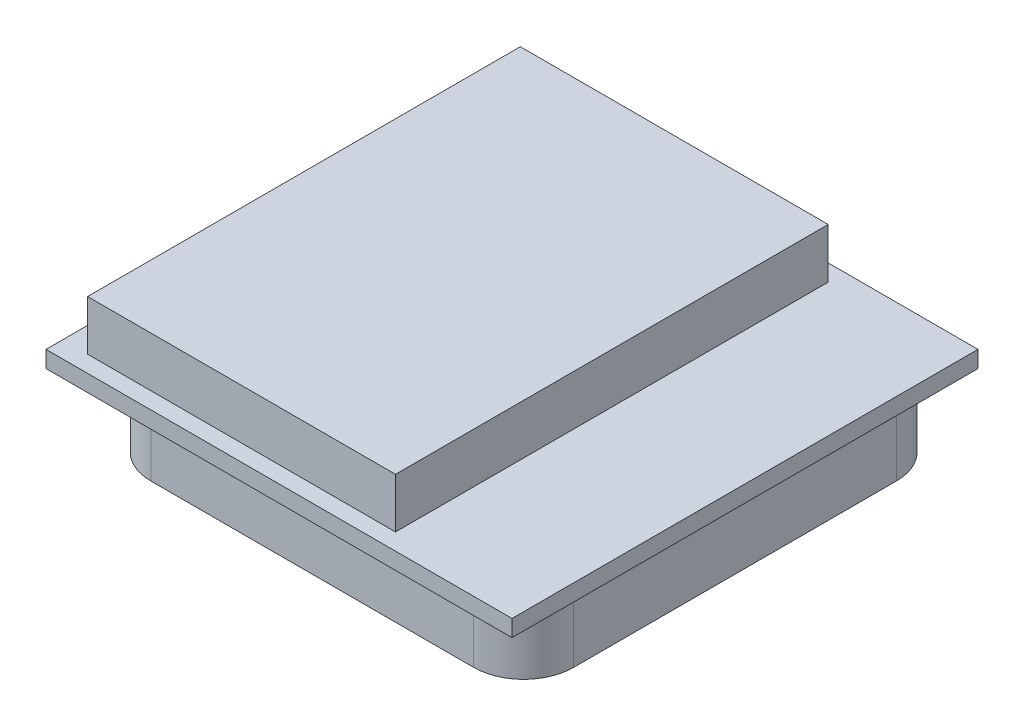
ISO-10303-21;
HEADER;
FILE_DESCRIPTION(('STEP AP214'),'2;1');
FILE_NAME('part.step','',(''),(''),'','','');
FILE_SCHEMA(('AUTOMOTIVE_DESIGN { 1 0 10303 214 1 1 1 1 }'));
ENDSEC;
DATA;
#1=APPLICATION_CONTEXT('core data for automotive mechanical design processes');
#2=APPLICATION_PROTOCOL_DEFINITION('international standard','automotive_design',2000,#1);
#3=PRODUCT_CONTEXT('',#1,'mechanical');
#4=PRODUCT('Part','Part','',(#3));
#5=PRODUCT_RELATED_PRODUCT_CATEGORY('part','',(#4));
#6=PRODUCT_DEFINITION_FORMATION('','',#4);
#7=PRODUCT_DEFINITION_CONTEXT('part definition',#1,'design');
#8=PRODUCT_DEFINITION('design','',#6,#7);
#9=PRODUCT_DEFINITION_SHAPE('','',#8);
#10=(LENGTH_UNIT() NAMED_UNIT(*) SI_UNIT(.MILLI.,.METRE.));
#11=(NAMED_UNIT(*) PLANE_ANGLE_UNIT() SI_UNIT($,.RADIAN.));
#12=(NAMED_UNIT(*) SI_UNIT($,.STERADIAN.) SOLID_ANGLE_UNIT());
#13=UNCERTAINTY_MEASURE_WITH_UNIT(LENGTH_MEASURE(1.E-05),#10,'distance_accuracy_value','');
#14=(GEOMETRIC_REPRESENTATION_CONTEXT(3) GLOBAL_UNCERTAINTY_ASSIGNED_CONTEXT((#13)) GLOBAL_UNIT_ASSIGNED_CONTEXT((#10,
#11,#12)) REPRESENTATION_CONTEXT('',''));
#15=CARTESIAN_POINT('',(0.,0.,0.));
#16=DIRECTION('',(0.,0.,1.));
#17=DIRECTION('',(1.,0.,0.));
#18=AXIS2_PLACEMENT_3D('',#15,#16,#17);
#19=CARTESIAN_POINT('',(0.,0.,0.));
#20=DIRECTION('',(0.,1.,0.));
#21=DIRECTION('',(0.,0.,1.));
#22=AXIS2_PLACEMENT_3D('',#19,#20,#21);
#23=PLANE('',#22);
#24=DIRECTION('',(0.,0.,1.));
#25=VECTOR('',#24,1.);
#26=CARTESIAN_POINT('',(-12.,0.,-12.7));
#27=LINE('',#26,#25);
#28=CARTESIAN_POINT('',(-12.,0.,-9.7));
#29=VERTEX_POINT('',#28);
#30=CARTESIAN_POINT('',(-12.,0.,9.7));
#31=VERTEX_POINT('',#30);
#32=EDGE_CURVE('E186',#29,#31,#27,.T.);
#33=ORIENTED_EDGE('',*,*,#32,.T.);
#34=CARTESIAN_POINT('',(-9.,0.,9.7));
#35=DIRECTION('',(0.,1.,0.));
#36=DIRECTION('',(0.,0.,1.));
#37=AXIS2_PLACEMENT_3D('',#34,#35,#36);
#38=CIRCLE('',#37,3.);
#39=CARTESIAN_POINT('',(-9.,0.,12.7));
#40=VERTEX_POINT('',#39);
#41=EDGE_CURVE('E270',#31,#40,#38,.T.);
#42=ORIENTED_EDGE('',*,*,#41,.T.);
#43=DIRECTION('',(1.,0.,0.));
#44=VECTOR('',#43,1.);
#45=CARTESIAN_POINT('',(-12.,0.,12.7));
#46=LINE('',#45,#44);
#47=CARTESIAN_POINT('',(10.4,0.,12.7));
#48=VERTEX_POINT('',#47);
#49=EDGE_CURVE('E200',#40,#48,#46,.T.);
#50=ORIENTED_EDGE('',*,*,#49,.T.);
#51=CARTESIAN_POINT('',(10.4,0.,9.7));
#52=DIRECTION('',(0.,1.,0.));
#53=DIRECTION('',(0.,0.,1.));
#54=AXIS2_PLACEMENT_3D('',#51,#52,#53);
#55=CIRCLE('',#54,3.);
#56=CARTESIAN_POINT('',(13.4,0.,9.7));
#57=VERTEX_POINT('',#56);
#58=EDGE_CURVE('E272',#48,#57,#55,.T.);
#59=ORIENTED_EDGE('',*,*,#58,.T.);
#60=DIRECTION('',(0.,0.,1.));
#61=VECTOR('',#60,1.);
#62=CARTESIAN_POINT('',(13.4,0.,-12.7));
#63=LINE('',#62,#61);
#64=CARTESIAN_POINT('',(13.4,0.,-9.7));
#65=VERTEX_POINT('',#64);
#66=EDGE_CURVE('E197',#65,#57,#63,.T.);
#67=ORIENTED_EDGE('',*,*,#66,.F.);
#68=CARTESIAN_POINT('',(10.4,0.,-9.7));
#69=DIRECTION('',(0.,1.,0.));
#70=DIRECTION('',(0.,0.,1.));
#71=AXIS2_PLACEMENT_3D('',#68,#69,#70);
#72=CIRCLE('',#71,3.);
#73=CARTESIAN_POINT('',(10.4,0.,-12.7));
#74=VERTEX_POINT('',#73);
#75=EDGE_CURVE('E43',#65,#74,#72,.T.);
#76=ORIENTED_EDGE('',*,*,#75,.T.);
#77=DIRECTION('',(1.,0.,0.));
#78=VECTOR('',#77,1.);
#79=CARTESIAN_POINT('',(-12.,0.,-12.7));
#80=LINE('',#79,#78);
#81=CARTESIAN_POINT('',(-9.,0.,-12.7));
#82=VERTEX_POINT('',#81);
#83=EDGE_CURVE('E177',#82,#74,#80,.T.);
#84=ORIENTED_EDGE('',*,*,#83,.F.);
#85=CARTESIAN_POINT('',(-9.,0.,-9.7));
#86=DIRECTION('',(0.,1.,0.));
#87=DIRECTION('',(0.,0.,1.));
#88=AXIS2_PLACEMENT_3D('',#85,#86,#87);
#89=CIRCLE('',#88,3.);
#90=EDGE_CURVE('E11',#82,#29,#89,.T.);
#91=ORIENTED_EDGE('',*,*,#90,.T.);
#92=EDGE_LOOP('',(#33,#42,#50,#59,#67,#76,#84,#91));
#93=FACE_BOUND('',#92,.T.);
#94=DIRECTION('',(1.,0.,0.));
#95=VECTOR('',#94,1.);
#96=CARTESIAN_POINT('',(0.,0.,14.));
#97=LINE('',#96,#95);
#98=CARTESIAN_POINT('',(-14.,0.,14.));
#99=VERTEX_POINT('',#98);
#100=CARTESIAN_POINT('',(14.,0.,14.));
#101=VERTEX_POINT('',#100);
#102=EDGE_CURVE('E195',#99,#101,#97,.T.);
#103=ORIENTED_EDGE('',*,*,#102,.F.);
#104=DIRECTION('',(0.,0.,-1.));
#105=VECTOR('',#104,1.);
#106=CARTESIAN_POINT('',(-14.,0.,0.));
#107=LINE('',#106,#105);
#108=CARTESIAN_POINT('',(-14.,0.,-14.));
#109=VERTEX_POINT('',#108);
#110=EDGE_CURVE('E209',#99,#109,#107,.T.);
#111=ORIENTED_EDGE('',*,*,#110,.T.);
#112=DIRECTION('',(1.,0.,0.));
#113=VECTOR('',#112,1.);
#114=CARTESIAN_POINT('',(0.,0.,-14.));
#115=LINE('',#114,#113);
#116=CARTESIAN_POINT('',(14.,0.,-14.));
#117=VERTEX_POINT('',#116);
#118=EDGE_CURVE('E223',#109,#117,#115,.T.);
#119=ORIENTED_EDGE('',*,*,#118,.T.);
#120=DIRECTION('',(0.,0.,-1.));
#121=VECTOR('',#120,1.);
#122=CARTESIAN_POINT('',(14.,0.,0.));
#123=LINE('',#122,#121);
#124=EDGE_CURVE('E220',#101,#117,#123,.T.);
#125=ORIENTED_EDGE('',*,*,#124,.F.);
#126=EDGE_LOOP('',(#103,#111,#119,#125));
#127=FACE_BOUND('',#126,.T.);
#128=ADVANCED_FACE('F35',(#93,#127),#23,.F.);
#129=CARTESIAN_POINT('',(0.,1.,14.));
#130=DIRECTION('',(0.,0.,-1.));
#131=DIRECTION('',(-1.,0.,0.));
#132=AXIS2_PLACEMENT_3D('',#129,#130,#131);
#133=PLANE('',#132);
#134=ORIENTED_EDGE('',*,*,#102,.T.);
#135=DIRECTION('',(0.,-1.,0.));
#136=VECTOR('',#135,1.);
#137=CARTESIAN_POINT('',(14.,1.,14.));
#138=LINE('',#137,#136);
#139=CARTESIAN_POINT('',(14.,1.,14.));
#140=VERTEX_POINT('',#139);
#141=EDGE_CURVE('E233',#140,#101,#138,.T.);
#142=ORIENTED_EDGE('',*,*,#141,.F.);
#143=DIRECTION('',(1.,0.,0.));
#144=VECTOR('',#143,1.);
#145=CARTESIAN_POINT('',(0.,1.,14.));
#146=LINE('',#145,#144);
#147=CARTESIAN_POINT('',(-14.,1.,14.));
#148=VERTEX_POINT('',#147);
#149=EDGE_CURVE('E205',#148,#140,#146,.T.);
#150=ORIENTED_EDGE('',*,*,#149,.F.);
#151=DIRECTION('',(0.,-1.,0.));
#152=VECTOR('',#151,1.);
#153=CARTESIAN_POINT('',(-14.,1.,14.));
#154=LINE('',#153,#152);
#155=EDGE_CURVE('E217',#148,#99,#154,.T.);
#156=ORIENTED_EDGE('',*,*,#155,.T.);
#157=EDGE_LOOP('',(#134,#142,#150,#156));
#158=FACE_BOUND('',#157,.T.);
#159=ADVANCED_FACE('F313',(#158),#133,.F.);
#160=CARTESIAN_POINT('',(14.,1.,0.));
#161=DIRECTION('',(-1.,0.,0.));
#162=DIRECTION('',(0.,0.,1.));
#163=AXIS2_PLACEMENT_3D('',#160,#161,#162);
#164=PLANE('',#163);
#165=ORIENTED_EDGE('',*,*,#124,.T.);
#166=DIRECTION('',(0.,-1.,0.));
#167=VECTOR('',#166,1.);
#168=CARTESIAN_POINT('',(14.,1.,-14.));
#169=LINE('',#168,#167);
#170=CARTESIAN_POINT('',(14.,1.,-14.));
#171=VERTEX_POINT('',#170);
#172=EDGE_CURVE('E231',#171,#117,#169,.T.);
#173=ORIENTED_EDGE('',*,*,#172,.F.);
#174=DIRECTION('',(0.,0.,-1.));
#175=VECTOR('',#174,1.);
#176=CARTESIAN_POINT('',(14.,1.,0.));
#177=LINE('',#176,#175);
#178=EDGE_CURVE('E208',#140,#171,#177,.T.);
#179=ORIENTED_EDGE('',*,*,#178,.F.);
#180=ORIENTED_EDGE('',*,*,#141,.T.);
#181=EDGE_LOOP('',(#165,#173,#179,#180));
#182=FACE_BOUND('',#181,.T.);
#183=ADVANCED_FACE('F318',(#182),#164,.F.);
#184=CARTESIAN_POINT('',(0.,1.,-14.));
#185=DIRECTION('',(0.,0.,-1.));
#186=DIRECTION('',(-1.,0.,0.));
#187=AXIS2_PLACEMENT_3D('',#184,#185,#186);
#188=PLANE('',#187);
#189=ORIENTED_EDGE('',*,*,#118,.F.);
#190=DIRECTION('',(0.,-1.,0.));
#191=VECTOR('',#190,1.);
#192=CARTESIAN_POINT('',(-14.,1.,-14.));
#193=LINE('',#192,#191);
#194=CARTESIAN_POINT('',(-14.,1.,-14.));
#195=VERTEX_POINT('',#194);
#196=EDGE_CURVE('E229',#195,#109,#193,.T.);
#197=ORIENTED_EDGE('',*,*,#196,.F.);
#198=DIRECTION('',(1.,0.,0.));
#199=VECTOR('',#198,1.);
#200=CARTESIAN_POINT('',(0.,1.,-14.));
#201=LINE('',#200,#199);
#202=EDGE_CURVE('E211',#195,#171,#201,.T.);
#203=ORIENTED_EDGE('',*,*,#202,.T.);
#204=ORIENTED_EDGE('',*,*,#172,.T.);
#205=EDGE_LOOP('',(#189,#197,#203,#204));
#206=FACE_BOUND('',#205,.T.);
#207=ADVANCED_FACE('F328',(#206),#188,.T.);
#208=CARTESIAN_POINT('',(-14.,1.,0.));
#209=DIRECTION('',(-1.,0.,0.));
#210=DIRECTION('',(0.,0.,1.));
#211=AXIS2_PLACEMENT_3D('',#208,#209,#210);
#212=PLANE('',#211);
#213=ORIENTED_EDGE('',*,*,#110,.F.);
#214=ORIENTED_EDGE('',*,*,#155,.F.);
#215=DIRECTION('',(0.,0.,-1.));
#216=VECTOR('',#215,1.);
#217=CARTESIAN_POINT('',(-14.,1.,0.));
#218=LINE('',#217,#216);
#219=EDGE_CURVE('E214',#148,#195,#218,.T.);
#220=ORIENTED_EDGE('',*,*,#219,.T.);
#221=ORIENTED_EDGE('',*,*,#196,.T.);
#222=EDGE_LOOP('',(#213,#214,#220,#221));
#223=FACE_BOUND('',#222,.T.);
#224=ADVANCED_FACE('F325',(#223),#212,.T.);
#225=CARTESIAN_POINT('',(0.,1.,0.));
#226=DIRECTION('',(0.,1.,0.));
#227=DIRECTION('',(0.,0.,1.));
#228=AXIS2_PLACEMENT_3D('',#225,#226,#227);
#229=PLANE('',#228);
#230=DIRECTION('',(-1.,0.,0.));
#231=VECTOR('',#230,1.);
#232=CARTESIAN_POINT('',(0.,1.,-13.));
#233=LINE('',#232,#231);
#234=CARTESIAN_POINT('',(6.,1.,-13.));
#235=VERTEX_POINT('',#234);
#236=CARTESIAN_POINT('',(-12.5,1.,-13.));
#237=VERTEX_POINT('',#236);
#238=EDGE_CURVE('E241',#235,#237,#233,.T.);
#239=ORIENTED_EDGE('',*,*,#238,.F.);
#240=DIRECTION('',(0.,0.,-1.));
#241=VECTOR('',#240,1.);
#242=CARTESIAN_POINT('',(6.,1.,0.));
#243=LINE('',#242,#241);
#244=CARTESIAN_POINT('',(6.,1.,13.));
#245=VERTEX_POINT('',#244);
#246=EDGE_CURVE('E153',#245,#235,#243,.T.);
#247=ORIENTED_EDGE('',*,*,#246,.F.);
#248=DIRECTION('',(-1.,0.,0.));
#249=VECTOR('',#248,1.);
#250=CARTESIAN_POINT('',(0.,1.,13.));
#251=LINE('',#250,#249);
#252=CARTESIAN_POINT('',(-12.5,1.,13.));
#253=VERTEX_POINT('',#252);
#254=EDGE_CURVE('E237',#245,#253,#251,.T.);
#255=ORIENTED_EDGE('',*,*,#254,.T.);
#256=DIRECTION('',(0.,0.,-1.));
#257=VECTOR('',#256,1.);
#258=CARTESIAN_POINT('',(-12.5,1.,0.));
#259=LINE('',#258,#257);
#260=EDGE_CURVE('E239',#253,#237,#259,.T.);
#261=ORIENTED_EDGE('',*,*,#260,.T.);
#262=EDGE_LOOP('',(#239,#247,#255,#261));
#263=FACE_BOUND('',#262,.T.);
#264=ORIENTED_EDGE('',*,*,#149,.T.);
#265=ORIENTED_EDGE('',*,*,#178,.T.);
#266=ORIENTED_EDGE('',*,*,#202,.F.);
#267=ORIENTED_EDGE('',*,*,#219,.F.);
#268=EDGE_LOOP('',(#264,#265,#266,#267));
#269=FACE_BOUND('',#268,.T.);
#270=ADVANCED_FACE('F323',(#263,#269),#229,.T.);
#271=CARTESIAN_POINT('',(-12.,-4.,-12.7));
#272=DIRECTION('',(0.,0.,1.));
#273=DIRECTION('',(1.,0.,0.));
#274=AXIS2_PLACEMENT_3D('',#271,#272,#273);
#275=PLANE('',#274);
#276=ORIENTED_EDGE('',*,*,#83,.T.);
#277=DIRECTION('',(0.,1.,0.));
#278=VECTOR('',#277,1.);
#279=CARTESIAN_POINT('',(10.4,-4.,-12.7));
#280=LINE('',#279,#278);
#281=CARTESIAN_POINT('',(10.4,-4.,-12.7));
#282=VERTEX_POINT('',#281);
#283=EDGE_CURVE('E268',#74,#282,#280,.F.);
#284=ORIENTED_EDGE('',*,*,#283,.T.);
#285=DIRECTION('',(1.,0.,0.));
#286=VECTOR('',#285,1.);
#287=CARTESIAN_POINT('',(-12.,-4.,-12.7));
#288=LINE('',#287,#286);
#289=CARTESIAN_POINT('',(-9.,-4.,-12.7));
#290=VERTEX_POINT('',#289);
#291=EDGE_CURVE('E182',#290,#282,#288,.T.);
#292=ORIENTED_EDGE('',*,*,#291,.F.);
#293=DIRECTION('',(0.,1.,0.));
#294=VECTOR('',#293,1.);
#295=CARTESIAN_POINT('',(-9.,0.,-12.7));
#296=LINE('',#295,#294);
#297=EDGE_CURVE('E266',#290,#82,#296,.T.);
#298=ORIENTED_EDGE('',*,*,#297,.T.);
#299=EDGE_LOOP('',(#276,#284,#292,#298));
#300=FACE_BOUND('',#299,.T.);
#301=ADVANCED_FACE('F302',(#300),#275,.F.);
#302=CARTESIAN_POINT('',(13.4,-4.,-12.7));
#303=DIRECTION('',(-1.,0.,0.));
#304=DIRECTION('',(0.,0.,1.));
#305=AXIS2_PLACEMENT_3D('',#302,#303,#304);
#306=PLANE('',#305);
#307=ORIENTED_EDGE('',*,*,#66,.T.);
#308=DIRECTION('',(0.,1.,0.));
#309=VECTOR('',#308,1.);
#310=CARTESIAN_POINT('',(13.4,-4.,9.7));
#311=LINE('',#310,#309);
#312=CARTESIAN_POINT('',(13.4,-4.,9.7));
#313=VERTEX_POINT('',#312);
#314=EDGE_CURVE('E264',#57,#313,#311,.F.);
#315=ORIENTED_EDGE('',*,*,#314,.T.);
#316=DIRECTION('',(0.,0.,1.));
#317=VECTOR('',#316,1.);
#318=CARTESIAN_POINT('',(13.4,-4.,-12.7));
#319=LINE('',#318,#317);
#320=CARTESIAN_POINT('',(13.4,-4.,-9.7));
#321=VERTEX_POINT('',#320);
#322=EDGE_CURVE('E185',#321,#313,#319,.T.);
#323=ORIENTED_EDGE('',*,*,#322,.F.);
#324=DIRECTION('',(0.,1.,0.));
#325=VECTOR('',#324,1.);
#326=CARTESIAN_POINT('',(13.4,-4.,-9.7));
#327=LINE('',#326,#325);
#328=EDGE_CURVE('E261',#321,#65,#327,.T.);
#329=ORIENTED_EDGE('',*,*,#328,.T.);
#330=EDGE_LOOP('',(#307,#315,#323,#329));
#331=FACE_BOUND('',#330,.T.);
#332=ADVANCED_FACE('F279',(#331),#306,.F.);
#333=CARTESIAN_POINT('',(-12.,-4.,12.7));
#334=DIRECTION('',(0.,0.,1.));
#335=DIRECTION('',(1.,0.,0.));
#336=AXIS2_PLACEMENT_3D('',#333,#334,#335);
#337=PLANE('',#336);
#338=ORIENTED_EDGE('',*,*,#49,.F.);
#339=DIRECTION('',(0.,1.,0.));
#340=VECTOR('',#339,1.);
#341=CARTESIAN_POINT('',(-9.,-4.,12.7));
#342=LINE('',#341,#340);
#343=CARTESIAN_POINT('',(-9.,-4.,12.7));
#344=VERTEX_POINT('',#343);
#345=EDGE_CURVE('E251',#40,#344,#342,.F.);
#346=ORIENTED_EDGE('',*,*,#345,.T.);
#347=DIRECTION('',(1.,0.,0.));
#348=VECTOR('',#347,1.);
#349=CARTESIAN_POINT('',(-12.,-4.,12.7));
#350=LINE('',#349,#348);
#351=CARTESIAN_POINT('',(10.4,-4.,12.7));
#352=VERTEX_POINT('',#351);
#353=EDGE_CURVE('E189',#344,#352,#350,.T.);
#354=ORIENTED_EDGE('',*,*,#353,.T.);
#355=DIRECTION('',(0.,1.,0.));
#356=VECTOR('',#355,1.);
#357=CARTESIAN_POINT('',(10.4,0.,12.7));
#358=LINE('',#357,#356);
#359=EDGE_CURVE('E248',#352,#48,#358,.T.);
#360=ORIENTED_EDGE('',*,*,#359,.T.);
#361=EDGE_LOOP('',(#338,#346,#354,#360));
#362=FACE_BOUND('',#361,.T.);
#363=ADVANCED_FACE('F289',(#362),#337,.T.);
#364=CARTESIAN_POINT('',(-12.,-4.,-12.7));
#365=DIRECTION('',(-1.,0.,0.));
#366=DIRECTION('',(0.,0.,1.));
#367=AXIS2_PLACEMENT_3D('',#364,#365,#366);
#368=PLANE('',#367);
#369=DIRECTION('',(0.,0.,1.));
#370=VECTOR('',#369,1.);
#371=CARTESIAN_POINT('',(-12.,-4.,-12.7));
#372=LINE('',#371,#370);
#373=CARTESIAN_POINT('',(-12.,-4.,-9.7));
#374=VERTEX_POINT('',#373);
#375=CARTESIAN_POINT('',(-12.,-4.,9.7));
#376=VERTEX_POINT('',#375);
#377=EDGE_CURVE('E192',#374,#376,#372,.T.);
#378=ORIENTED_EDGE('',*,*,#377,.T.);
#379=DIRECTION('',(0.,1.,0.));
#380=VECTOR('',#379,1.);
#381=CARTESIAN_POINT('',(-12.,-4.,9.7));
#382=LINE('',#381,#380);
#383=EDGE_CURVE('E245',#376,#31,#382,.T.);
#384=ORIENTED_EDGE('',*,*,#383,.T.);
#385=ORIENTED_EDGE('',*,*,#32,.F.);
#386=DIRECTION('',(0.,1.,0.));
#387=VECTOR('',#386,1.);
#388=CARTESIAN_POINT('',(-12.,-4.,-9.7));
#389=LINE('',#388,#387);
#390=EDGE_CURVE('E243',#29,#374,#389,.F.);
#391=ORIENTED_EDGE('',*,*,#390,.T.);
#392=EDGE_LOOP('',(#378,#384,#385,#391));
#393=FACE_BOUND('',#392,.T.);
#394=ADVANCED_FACE('F297',(#393),#368,.T.);
#395=CARTESIAN_POINT('',(0.,-4.,0.));
#396=DIRECTION('',(0.,-1.,0.));
#397=DIRECTION('',(0.,0.,-1.));
#398=AXIS2_PLACEMENT_3D('',#395,#396,#397);
#399=PLANE('',#398);
#400=ORIENTED_EDGE('',*,*,#353,.F.);
#401=CARTESIAN_POINT('',(-9.,-4.,9.7));
#402=DIRECTION('',(0.,-1.,0.));
#403=DIRECTION('',(0.,0.,-1.));
#404=AXIS2_PLACEMENT_3D('',#401,#402,#403);
#405=CIRCLE('',#404,3.);
#406=EDGE_CURVE('E259',#344,#376,#405,.T.);
#407=ORIENTED_EDGE('',*,*,#406,.T.);
#408=ORIENTED_EDGE('',*,*,#377,.F.);
#409=CARTESIAN_POINT('',(-9.,-4.,-9.7));
#410=DIRECTION('',(0.,-1.,0.));
#411=DIRECTION('',(0.,0.,-1.));
#412=AXIS2_PLACEMENT_3D('',#409,#410,#411);
#413=CIRCLE('',#412,3.);
#414=EDGE_CURVE('E253',#374,#290,#413,.T.);
#415=ORIENTED_EDGE('',*,*,#414,.T.);
#416=ORIENTED_EDGE('',*,*,#291,.T.);
#417=CARTESIAN_POINT('',(10.4,-4.,-9.7));
#418=DIRECTION('',(0.,-1.,0.));
#419=DIRECTION('',(0.,0.,-1.));
#420=AXIS2_PLACEMENT_3D('',#417,#418,#419);
#421=CIRCLE('',#420,3.);
#422=EDGE_CURVE('E255',#282,#321,#421,.T.);
#423=ORIENTED_EDGE('',*,*,#422,.T.);
#424=ORIENTED_EDGE('',*,*,#322,.T.);
#425=CARTESIAN_POINT('',(10.4,-4.,9.7));
#426=DIRECTION('',(0.,-1.,0.));
#427=DIRECTION('',(0.,0.,-1.));
#428=AXIS2_PLACEMENT_3D('',#425,#426,#427);
#429=CIRCLE('',#428,3.);
#430=EDGE_CURVE('E257',#313,#352,#429,.T.);
#431=ORIENTED_EDGE('',*,*,#430,.T.);
#432=EDGE_LOOP('',(#400,#407,#408,#415,#416,#423,#424,#431));
#433=FACE_BOUND('',#432,.T.);
#434=ADVANCED_FACE('F286',(#433),#399,.T.);
#435=CARTESIAN_POINT('',(-12.5,4.,-13.));
#436=DIRECTION('',(0.,0.,-1.));
#437=DIRECTION('',(-1.,0.,0.));
#438=AXIS2_PLACEMENT_3D('',#435,#436,#437);
#439=PLANE('',#438);
#440=DIRECTION('',(0.,-1.,0.));
#441=VECTOR('',#440,1.);
#442=CARTESIAN_POINT('',(6.,4.,-13.));
#443=LINE('',#442,#441);
#444=CARTESIAN_POINT('',(6.,4.,-13.));
#445=VERTEX_POINT('',#444);
#446=EDGE_CURVE('E148',#445,#235,#443,.T.);
#447=ORIENTED_EDGE('',*,*,#446,.T.);
#448=ORIENTED_EDGE('',*,*,#238,.T.);
#449=DIRECTION('',(0.,-1.,0.));
#450=VECTOR('',#449,1.);
#451=CARTESIAN_POINT('',(-12.5,4.,-13.));
#452=LINE('',#451,#450);
#453=CARTESIAN_POINT('',(-12.5,4.,-13.));
#454=VERTEX_POINT('',#453);
#455=EDGE_CURVE('E170',#454,#237,#452,.T.);
#456=ORIENTED_EDGE('',*,*,#455,.F.);
#457=DIRECTION('',(1.,0.,0.));
#458=VECTOR('',#457,1.);
#459=CARTESIAN_POINT('',(-12.5,4.,-13.));
#460=LINE('',#459,#458);
#461=EDGE_CURVE('E163',#454,#445,#460,.T.);
#462=ORIENTED_EDGE('',*,*,#461,.T.);
#463=EDGE_LOOP('',(#447,#448,#456,#462));
#464=FACE_BOUND('',#463,.T.);
#465=ADVANCED_FACE('F168',(#464),#439,.T.);
#466=CARTESIAN_POINT('',(-12.5,4.,-13.));
#467=DIRECTION('',(1.,0.,0.));
#468=DIRECTION('',(0.,0.,-1.));
#469=AXIS2_PLACEMENT_3D('',#466,#467,#468);
#470=PLANE('',#469);
#471=ORIENTED_EDGE('',*,*,#260,.F.);
#472=DIRECTION('',(0.,-1.,0.));
#473=VECTOR('',#472,1.);
#474=CARTESIAN_POINT('',(-12.5,4.,13.));
#475=LINE('',#474,#473);
#476=CARTESIAN_POINT('',(-12.5,4.,13.));
#477=VERTEX_POINT('',#476);
#478=EDGE_CURVE('E178',#477,#253,#475,.T.);
#479=ORIENTED_EDGE('',*,*,#478,.F.);
#480=DIRECTION('',(0.,0.,1.));
#481=VECTOR('',#480,1.);
#482=CARTESIAN_POINT('',(-12.5,4.,-13.));
#483=LINE('',#482,#481);
#484=EDGE_CURVE('E158',#454,#477,#483,.T.);
#485=ORIENTED_EDGE('',*,*,#484,.F.);
#486=ORIENTED_EDGE('',*,*,#455,.T.);
#487=EDGE_LOOP('',(#471,#479,#485,#486));
#488=FACE_BOUND('',#487,.T.);
#489=ADVANCED_FACE('F347',(#488),#470,.F.);
#490=CARTESIAN_POINT('',(-12.5,4.,13.));
#491=DIRECTION('',(0.,0.,-1.));
#492=DIRECTION('',(-1.,0.,0.));
#493=AXIS2_PLACEMENT_3D('',#490,#491,#492);
#494=PLANE('',#493);
#495=ORIENTED_EDGE('',*,*,#254,.F.);
#496=DIRECTION('',(0.,-1.,0.));
#497=VECTOR('',#496,1.);
#498=CARTESIAN_POINT('',(6.,4.,13.));
#499=LINE('',#498,#497);
#500=CARTESIAN_POINT('',(6.,4.,13.));
#501=VERTEX_POINT('',#500);
#502=EDGE_CURVE('E157',#501,#245,#499,.T.);
#503=ORIENTED_EDGE('',*,*,#502,.F.);
#504=DIRECTION('',(1.,0.,0.));
#505=VECTOR('',#504,1.);
#506=CARTESIAN_POINT('',(-12.5,4.,13.));
#507=LINE('',#506,#505);
#508=EDGE_CURVE('E165',#477,#501,#507,.T.);
#509=ORIENTED_EDGE('',*,*,#508,.F.);
#510=ORIENTED_EDGE('',*,*,#478,.T.);
#511=EDGE_LOOP('',(#495,#503,#509,#510));
#512=FACE_BOUND('',#511,.T.);
#513=ADVANCED_FACE('F344',(#512),#494,.F.);
#514=CARTESIAN_POINT('',(6.,4.,-13.));
#515=DIRECTION('',(1.,0.,0.));
#516=DIRECTION('',(0.,0.,-1.));
#517=AXIS2_PLACEMENT_3D('',#514,#515,#516);
#518=PLANE('',#517);
#519=ORIENTED_EDGE('',*,*,#502,.T.);
#520=ORIENTED_EDGE('',*,*,#246,.T.);
#521=ORIENTED_EDGE('',*,*,#446,.F.);
#522=DIRECTION('',(0.,0.,1.));
#523=VECTOR('',#522,1.);
#524=CARTESIAN_POINT('',(6.,4.,-13.));
#525=LINE('',#524,#523);
#526=EDGE_CURVE('E152',#445,#501,#525,.T.);
#527=ORIENTED_EDGE('',*,*,#526,.T.);
#528=EDGE_LOOP('',(#519,#520,#521,#527));
#529=FACE_BOUND('',#528,.T.);
#530=ADVANCED_FACE('F151',(#529),#518,.T.);
#531=CARTESIAN_POINT('',(0.,4.,0.));
#532=DIRECTION('',(0.,-1.,0.));
#533=DIRECTION('',(0.,0.,-1.));
#534=AXIS2_PLACEMENT_3D('',#531,#532,#533);
#535=PLANE('',#534);
#536=ORIENTED_EDGE('',*,*,#461,.F.);
#537=ORIENTED_EDGE('',*,*,#484,.T.);
#538=ORIENTED_EDGE('',*,*,#508,.T.);
#539=ORIENTED_EDGE('',*,*,#526,.F.);
#540=EDGE_LOOP('',(#536,#537,#538,#539));
#541=FACE_BOUND('',#540,.T.);
#542=ADVANCED_FACE('F162',(#541),#535,.F.);
#543=CARTESIAN_POINT('',(-9.,-4.,9.7));
#544=DIRECTION('',(0.,1.,0.));
#545=DIRECTION('',(0.,0.,1.));
#546=AXIS2_PLACEMENT_3D('',#543,#544,#545);
#547=CYLINDRICAL_SURFACE('',#546,3.);
#548=ORIENTED_EDGE('',*,*,#406,.F.);
#549=ORIENTED_EDGE('',*,*,#345,.F.);
#550=ORIENTED_EDGE('',*,*,#41,.F.);
#551=ORIENTED_EDGE('',*,*,#383,.F.);
#552=EDGE_LOOP('',(#548,#549,#550,#551));
#553=FACE_BOUND('',#552,.T.);
#554=ADVANCED_FACE('F292',(#553),#547,.T.);
#555=CARTESIAN_POINT('',(10.4,-4.,9.7));
#556=DIRECTION('',(0.,-1.,0.));
#557=DIRECTION('',(0.,0.,-1.));
#558=AXIS2_PLACEMENT_3D('',#555,#556,#557);
#559=CYLINDRICAL_SURFACE('',#558,3.);
#560=ORIENTED_EDGE('',*,*,#430,.F.);
#561=ORIENTED_EDGE('',*,*,#314,.F.);
#562=ORIENTED_EDGE('',*,*,#58,.F.);
#563=ORIENTED_EDGE('',*,*,#359,.F.);
#564=EDGE_LOOP('',(#560,#561,#562,#563));
#565=FACE_BOUND('',#564,.T.);
#566=ADVANCED_FACE('F283',(#565),#559,.T.);
#567=CARTESIAN_POINT('',(10.4,-4.,-9.7));
#568=DIRECTION('',(0.,1.,0.));
#569=DIRECTION('',(0.,0.,1.));
#570=AXIS2_PLACEMENT_3D('',#567,#568,#569);
#571=CYLINDRICAL_SURFACE('',#570,3.);
#572=ORIENTED_EDGE('',*,*,#422,.F.);
#573=ORIENTED_EDGE('',*,*,#283,.F.);
#574=ORIENTED_EDGE('',*,*,#75,.F.);
#575=ORIENTED_EDGE('',*,*,#328,.F.);
#576=EDGE_LOOP('',(#572,#573,#574,#575));
#577=FACE_BOUND('',#576,.T.);
#578=ADVANCED_FACE('F305',(#577),#571,.T.);
#579=CARTESIAN_POINT('',(-9.,-4.,-9.7));
#580=DIRECTION('',(0.,-1.,0.));
#581=DIRECTION('',(0.,0.,-1.));
#582=AXIS2_PLACEMENT_3D('',#579,#580,#581);
#583=CYLINDRICAL_SURFACE('',#582,3.);
#584=ORIENTED_EDGE('',*,*,#414,.F.);
#585=ORIENTED_EDGE('',*,*,#390,.F.);
#586=ORIENTED_EDGE('',*,*,#90,.F.);
#587=ORIENTED_EDGE('',*,*,#297,.F.);
#588=EDGE_LOOP('',(#584,#585,#586,#587));
#589=FACE_BOUND('',#588,.T.);
#590=ADVANCED_FACE('F37',(#589),#583,.T.);
#591=CLOSED_SHELL('',(#128,#159,#183,#207,#224,#270,#301,#332,#363,#394,#434,#465,#489,#513,
#530,#542,#554,#566,#578,#590));
#592=MANIFOLD_SOLID_BREP('B2',#591);
#593=ADVANCED_BREP_SHAPE_REPRESENTATION('',(#18,#592),#14);
#594=SHAPE_DEFINITION_REPRESENTATION(#9,#593);
ENDSEC;
END-ISO-10303-21;
